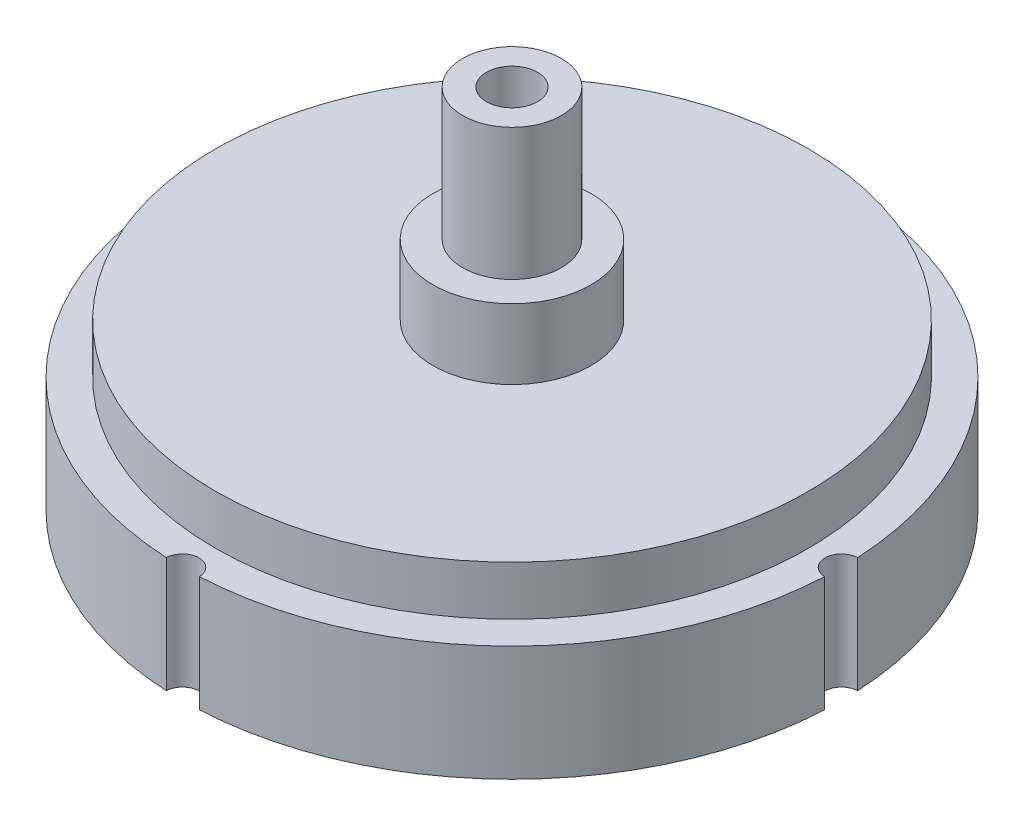
ISO-10303-21;
HEADER;
FILE_DESCRIPTION(('STEP AP214'),'2;1');
FILE_NAME('part.step','',(''),(''),'','','');
FILE_SCHEMA(('AUTOMOTIVE_DESIGN { 1 0 10303 214 1 1 1 1 }'));
ENDSEC;
DATA;
#1=APPLICATION_CONTEXT('core data for automotive mechanical design processes');
#2=APPLICATION_PROTOCOL_DEFINITION('international standard','automotive_design',2000,#1);
#3=PRODUCT_CONTEXT('',#1,'mechanical');
#4=PRODUCT('Part','Part','',(#3));
#5=PRODUCT_RELATED_PRODUCT_CATEGORY('part','',(#4));
#6=PRODUCT_DEFINITION_FORMATION('','',#4);
#7=PRODUCT_DEFINITION_CONTEXT('part definition',#1,'design');
#8=PRODUCT_DEFINITION('design','',#6,#7);
#9=PRODUCT_DEFINITION_SHAPE('','',#8);
#10=(LENGTH_UNIT() NAMED_UNIT(*) SI_UNIT(.MILLI.,.METRE.));
#11=(NAMED_UNIT(*) PLANE_ANGLE_UNIT() SI_UNIT($,.RADIAN.));
#12=(NAMED_UNIT(*) SI_UNIT($,.STERADIAN.) SOLID_ANGLE_UNIT());
#13=UNCERTAINTY_MEASURE_WITH_UNIT(LENGTH_MEASURE(1.E-05),#10,'distance_accuracy_value','');
#14=(GEOMETRIC_REPRESENTATION_CONTEXT(3) GLOBAL_UNCERTAINTY_ASSIGNED_CONTEXT((#13)) GLOBAL_UNIT_ASSIGNED_CONTEXT((#10,
#11,#12)) REPRESENTATION_CONTEXT('',''));
#15=CARTESIAN_POINT('',(0.,0.,0.));
#16=DIRECTION('',(0.,0.,1.));
#17=DIRECTION('',(1.,0.,0.));
#18=AXIS2_PLACEMENT_3D('',#15,#16,#17);
#19=CARTESIAN_POINT('',(0.,0.,0.));
#20=DIRECTION('',(0.,-1.,0.));
#21=DIRECTION('',(0.,0.,-1.));
#22=AXIS2_PLACEMENT_3D('',#19,#20,#21);
#23=CYLINDRICAL_SURFACE('',#22,10.);
#24=CARTESIAN_POINT('',(0.,0.,0.));
#25=DIRECTION('',(0.,-1.,0.));
#26=DIRECTION('',(0.,0.,-1.));
#27=AXIS2_PLACEMENT_3D('',#24,#25,#26);
#28=CIRCLE('',#27,10.);
#29=CARTESIAN_POINT('',(-0.499843725578301,0.,9.9875));
#30=VERTEX_POINT('',#29);
#31=CARTESIAN_POINT('',(-9.9875,0.,0.499843725578313));
#32=VERTEX_POINT('',#31);
#33=EDGE_CURVE('E153',#30,#32,#28,.T.);
#34=ORIENTED_EDGE('',*,*,#33,.F.);
#35=DIRECTION('',(0.,-1.,0.));
#36=VECTOR('',#35,1.);
#37=CARTESIAN_POINT('',(-0.499843725578305,5.562494,9.9875));
#38=LINE('',#37,#36);
#39=CARTESIAN_POINT('',(-0.499843725578312,3.5,9.9875));
#40=VERTEX_POINT('',#39);
#41=EDGE_CURVE('E169',#30,#40,#38,.F.);
#42=ORIENTED_EDGE('',*,*,#41,.T.);
#43=CARTESIAN_POINT('',(0.,3.5,0.));
#44=DIRECTION('',(0.,-1.,0.));
#45=DIRECTION('',(0.,0.,-1.));
#46=AXIS2_PLACEMENT_3D('',#43,#44,#45);
#47=CIRCLE('',#46,10.);
#48=CARTESIAN_POINT('',(-9.9875,3.5,0.499843725578312));
#49=VERTEX_POINT('',#48);
#50=EDGE_CURVE('E135',#40,#49,#47,.T.);
#51=ORIENTED_EDGE('',*,*,#50,.T.);
#52=DIRECTION('',(0.,-1.,0.));
#53=VECTOR('',#52,1.);
#54=CARTESIAN_POINT('',(-9.9875,5.562494,0.499843725578306));
#55=LINE('',#54,#53);
#56=EDGE_CURVE('E69',#49,#32,#55,.T.);
#57=ORIENTED_EDGE('',*,*,#56,.T.);
#58=EDGE_LOOP('',(#34,#42,#51,#57));
#59=FACE_BOUND('',#58,.T.);
#60=ADVANCED_FACE('F45',(#59),#23,.T.);
#61=CARTESIAN_POINT('',(9.9875,3.5,0.499843725578312));
#62=VERTEX_POINT('',#61);
#63=CARTESIAN_POINT('',(0.499843725578312,3.5,9.9875));
#64=VERTEX_POINT('',#63);
#65=EDGE_CURVE('E141',#62,#64,#47,.T.);
#66=ORIENTED_EDGE('',*,*,#65,.T.);
#67=DIRECTION('',(0.,-1.,0.));
#68=VECTOR('',#67,1.);
#69=CARTESIAN_POINT('',(0.499843725578305,5.562494,9.9875));
#70=LINE('',#69,#68);
#71=CARTESIAN_POINT('',(0.499843725578304,0.,9.9875));
#72=VERTEX_POINT('',#71);
#73=EDGE_CURVE('E162',#64,#72,#70,.T.);
#74=ORIENTED_EDGE('',*,*,#73,.T.);
#75=CARTESIAN_POINT('',(9.9875,0.,0.499843725578306));
#76=VERTEX_POINT('',#75);
#77=EDGE_CURVE('E256',#76,#72,#28,.T.);
#78=ORIENTED_EDGE('',*,*,#77,.F.);
#79=DIRECTION('',(0.,-1.,0.));
#80=VECTOR('',#79,1.);
#81=CARTESIAN_POINT('',(9.9875,5.562494,0.499843725578306));
#82=LINE('',#81,#80);
#83=EDGE_CURVE('E164',#76,#62,#82,.F.);
#84=ORIENTED_EDGE('',*,*,#83,.T.);
#85=EDGE_LOOP('',(#66,#74,#78,#84));
#86=FACE_BOUND('',#85,.T.);
#87=ADVANCED_FACE('F160',(#86),#23,.T.);
#88=CARTESIAN_POINT('',(0.499843725578312,3.5,-9.9875));
#89=VERTEX_POINT('',#88);
#90=CARTESIAN_POINT('',(9.9875,3.5,-0.499843725578312));
#91=VERTEX_POINT('',#90);
#92=EDGE_CURVE('E138',#89,#91,#47,.T.);
#93=ORIENTED_EDGE('',*,*,#92,.T.);
#94=DIRECTION('',(0.,-1.,0.));
#95=VECTOR('',#94,1.);
#96=CARTESIAN_POINT('',(9.9875,5.562494,-0.499843725578306));
#97=LINE('',#96,#95);
#98=CARTESIAN_POINT('',(9.9875,0.,-0.499843725578305));
#99=VERTEX_POINT('',#98);
#100=EDGE_CURVE('E276',#91,#99,#97,.T.);
#101=ORIENTED_EDGE('',*,*,#100,.T.);
#102=CARTESIAN_POINT('',(0.499843725578305,0.,-9.9875));
#103=VERTEX_POINT('',#102);
#104=EDGE_CURVE('E154',#103,#99,#28,.T.);
#105=ORIENTED_EDGE('',*,*,#104,.F.);
#106=DIRECTION('',(0.,-1.,0.));
#107=VECTOR('',#106,1.);
#108=CARTESIAN_POINT('',(0.499843725578305,5.562494,-9.9875));
#109=LINE('',#108,#107);
#110=EDGE_CURVE('E267',#103,#89,#109,.F.);
#111=ORIENTED_EDGE('',*,*,#110,.T.);
#112=EDGE_LOOP('',(#93,#101,#105,#111));
#113=FACE_BOUND('',#112,.T.);
#114=ADVANCED_FACE('F233',(#113),#23,.T.);
#115=CARTESIAN_POINT('',(-1.5,11.125,0.));
#116=DIRECTION('',(0.,-1.,0.));
#117=DIRECTION('',(0.,0.,-1.));
#118=AXIS2_PLACEMENT_3D('',#115,#116,#117);
#119=PLANE('',#118);
#120=CARTESIAN_POINT('',(0.,11.125,0.));
#121=DIRECTION('',(0.,-1.,0.));
#122=DIRECTION('',(0.,0.,-1.));
#123=AXIS2_PLACEMENT_3D('',#120,#121,#122);
#124=CIRCLE('',#123,1.5);
#125=CARTESIAN_POINT('',(0.,11.125,-1.5));
#126=VERTEX_POINT('',#125);
#127=EDGE_CURVE('E179',#126,#126,#124,.T.);
#128=ORIENTED_EDGE('',*,*,#127,.F.);
#129=EDGE_LOOP('',(#128));
#130=FACE_BOUND('',#129,.T.);
#131=CARTESIAN_POINT('',(0.,11.125,0.));
#132=DIRECTION('',(0.,-1.,0.));
#133=DIRECTION('',(0.,0.,-1.));
#134=AXIS2_PLACEMENT_3D('',#131,#132,#133);
#135=CIRCLE('',#134,0.775);
#136=CARTESIAN_POINT('',(0.,11.125,-0.775));
#137=VERTEX_POINT('',#136);
#138=EDGE_CURVE('E119',#137,#137,#135,.T.);
#139=ORIENTED_EDGE('',*,*,#138,.T.);
#140=EDGE_LOOP('',(#139));
#141=FACE_BOUND('',#140,.T.);
#142=ADVANCED_FACE('F47',(#130,#141),#119,.F.);
#143=CARTESIAN_POINT('',(0.,0.,0.));
#144=DIRECTION('',(0.,-1.,0.));
#145=DIRECTION('',(0.,0.,-1.));
#146=AXIS2_PLACEMENT_3D('',#143,#144,#145);
#147=CYLINDRICAL_SURFACE('',#146,0.774999999999999);
#148=ORIENTED_EDGE('',*,*,#138,.F.);
#149=EDGE_LOOP('',(#148));
#150=FACE_BOUND('',#149,.T.);
#151=CARTESIAN_POINT('',(0.,4.,0.));
#152=DIRECTION('',(0.,-1.,0.));
#153=DIRECTION('',(0.,0.,-1.));
#154=AXIS2_PLACEMENT_3D('',#151,#152,#153);
#155=CIRCLE('',#154,0.774999999999999);
#156=CARTESIAN_POINT('',(0.,4.,-0.774999999999999));
#157=VERTEX_POINT('',#156);
#158=EDGE_CURVE('E238',#157,#157,#155,.T.);
#159=ORIENTED_EDGE('',*,*,#158,.T.);
#160=EDGE_LOOP('',(#159));
#161=FACE_BOUND('',#160,.T.);
#162=ADVANCED_FACE('F232',(#150,#161),#147,.F.);
#163=CARTESIAN_POINT('',(-1.2,4.,0.));
#164=DIRECTION('',(0.,1.,0.));
#165=DIRECTION('',(0.,0.,1.));
#166=AXIS2_PLACEMENT_3D('',#163,#164,#165);
#167=PLANE('',#166);
#168=ORIENTED_EDGE('',*,*,#158,.F.);
#169=EDGE_LOOP('',(#168));
#170=FACE_BOUND('',#169,.T.);
#171=CARTESIAN_POINT('',(0.,4.,0.));
#172=DIRECTION('',(0.,-1.,0.));
#173=DIRECTION('',(0.,0.,-1.));
#174=AXIS2_PLACEMENT_3D('',#171,#172,#173);
#175=CIRCLE('',#174,1.2);
#176=CARTESIAN_POINT('',(0.,4.,-1.2));
#177=VERTEX_POINT('',#176);
#178=EDGE_CURVE('E242',#177,#177,#175,.T.);
#179=ORIENTED_EDGE('',*,*,#178,.T.);
#180=EDGE_LOOP('',(#179));
#181=FACE_BOUND('',#180,.T.);
#182=ADVANCED_FACE('F404',(#170,#181),#167,.F.);
#183=CARTESIAN_POINT('',(0.,0.,0.));
#184=DIRECTION('',(0.,-1.,0.));
#185=DIRECTION('',(0.,0.,-1.));
#186=AXIS2_PLACEMENT_3D('',#183,#184,#185);
#187=CYLINDRICAL_SURFACE('',#186,1.2);
#188=ORIENTED_EDGE('',*,*,#178,.F.);
#189=EDGE_LOOP('',(#188));
#190=FACE_BOUND('',#189,.T.);
#191=CARTESIAN_POINT('',(0.,0.,0.));
#192=DIRECTION('',(0.,-1.,0.));
#193=DIRECTION('',(0.,0.,-1.));
#194=AXIS2_PLACEMENT_3D('',#191,#192,#193);
#195=CIRCLE('',#194,1.2);
#196=CARTESIAN_POINT('',(0.,0.,-1.2));
#197=VERTEX_POINT('',#196);
#198=EDGE_CURVE('E251',#197,#197,#195,.T.);
#199=ORIENTED_EDGE('',*,*,#198,.T.);
#200=EDGE_LOOP('',(#199));
#201=FACE_BOUND('',#200,.T.);
#202=ADVANCED_FACE('F304',(#190,#201),#187,.F.);
#203=CARTESIAN_POINT('',(-1.2,0.,0.));
#204=DIRECTION('',(0.,1.,0.));
#205=DIRECTION('',(0.,0.,1.));
#206=AXIS2_PLACEMENT_3D('',#203,#204,#205);
#207=PLANE('',#206);
#208=ORIENTED_EDGE('',*,*,#198,.F.);
#209=EDGE_LOOP('',(#208));
#210=FACE_BOUND('',#209,.T.);
#211=ORIENTED_EDGE('',*,*,#77,.T.);
#212=CARTESIAN_POINT('',(0.,0.,10.));
#213=DIRECTION('',(0.,1.,0.));
#214=DIRECTION('',(0.,0.,1.));
#215=AXIS2_PLACEMENT_3D('',#212,#213,#214);
#216=CIRCLE('',#215,0.5);
#217=EDGE_CURVE('E175',#72,#30,#216,.T.);
#218=ORIENTED_EDGE('',*,*,#217,.T.);
#219=ORIENTED_EDGE('',*,*,#33,.T.);
#220=CARTESIAN_POINT('',(-10.,0.,0.));
#221=DIRECTION('',(0.,1.,0.));
#222=DIRECTION('',(0.,0.,1.));
#223=AXIS2_PLACEMENT_3D('',#220,#221,#222);
#224=CIRCLE('',#223,0.500000000000001);
#225=CARTESIAN_POINT('',(-9.9875,0.,-0.499843725578301));
#226=VERTEX_POINT('',#225);
#227=EDGE_CURVE('E129',#32,#226,#224,.T.);
#228=ORIENTED_EDGE('',*,*,#227,.T.);
#229=CARTESIAN_POINT('',(-0.499843725578305,0.,-9.9875));
#230=VERTEX_POINT('',#229);
#231=EDGE_CURVE('E127',#226,#230,#28,.T.);
#232=ORIENTED_EDGE('',*,*,#231,.T.);
#233=CARTESIAN_POINT('',(0.,0.,-10.));
#234=DIRECTION('',(0.,1.,0.));
#235=DIRECTION('',(0.,0.,1.));
#236=AXIS2_PLACEMENT_3D('',#233,#234,#235);
#237=CIRCLE('',#236,0.5);
#238=EDGE_CURVE('E273',#230,#103,#237,.T.);
#239=ORIENTED_EDGE('',*,*,#238,.T.);
#240=ORIENTED_EDGE('',*,*,#104,.T.);
#241=CARTESIAN_POINT('',(10.,0.,0.));
#242=DIRECTION('',(0.,1.,0.));
#243=DIRECTION('',(0.,0.,1.));
#244=AXIS2_PLACEMENT_3D('',#241,#242,#243);
#245=CIRCLE('',#244,0.500000000000001);
#246=EDGE_CURVE('E181',#99,#76,#245,.T.);
#247=ORIENTED_EDGE('',*,*,#246,.T.);
#248=EDGE_LOOP('',(#211,#218,#219,#228,#232,#239,#240,#247));
#249=FACE_BOUND('',#248,.T.);
#250=ADVANCED_FACE('F263',(#210,#249),#207,.F.);
#251=CARTESIAN_POINT('',(-9.9875,3.5,-0.499843725578312));
#252=VERTEX_POINT('',#251);
#253=CARTESIAN_POINT('',(-0.499843725578312,3.5,-9.9875));
#254=VERTEX_POINT('',#253);
#255=EDGE_CURVE('E125',#252,#254,#47,.T.);
#256=ORIENTED_EDGE('',*,*,#255,.T.);
#257=DIRECTION('',(0.,-1.,0.));
#258=VECTOR('',#257,1.);
#259=CARTESIAN_POINT('',(-0.499843725578305,5.562494,-9.9875));
#260=LINE('',#259,#258);
#261=EDGE_CURVE('E61',#254,#230,#260,.T.);
#262=ORIENTED_EDGE('',*,*,#261,.T.);
#263=ORIENTED_EDGE('',*,*,#231,.F.);
#264=DIRECTION('',(0.,-1.,0.));
#265=VECTOR('',#264,1.);
#266=CARTESIAN_POINT('',(-9.9875,5.562494,-0.499843725578306));
#267=LINE('',#266,#265);
#268=EDGE_CURVE('E111',#226,#252,#267,.F.);
#269=ORIENTED_EDGE('',*,*,#268,.T.);
#270=EDGE_LOOP('',(#256,#262,#263,#269));
#271=FACE_BOUND('',#270,.T.);
#272=ADVANCED_FACE('F124',(#271),#23,.T.);
#273=CARTESIAN_POINT('',(-10.,3.5,0.));
#274=DIRECTION('',(0.,-1.,0.));
#275=DIRECTION('',(0.,0.,-1.));
#276=AXIS2_PLACEMENT_3D('',#273,#274,#275);
#277=PLANE('',#276);
#278=ORIENTED_EDGE('',*,*,#50,.F.);
#279=CARTESIAN_POINT('',(0.,3.5,10.));
#280=DIRECTION('',(0.,-1.,0.));
#281=DIRECTION('',(0.,0.,-1.));
#282=AXIS2_PLACEMENT_3D('',#279,#280,#281);
#283=CIRCLE('',#282,0.5);
#284=EDGE_CURVE('E12',#40,#64,#283,.T.);
#285=ORIENTED_EDGE('',*,*,#284,.T.);
#286=ORIENTED_EDGE('',*,*,#65,.F.);
#287=CARTESIAN_POINT('',(10.,3.5,0.));
#288=DIRECTION('',(0.,-1.,0.));
#289=DIRECTION('',(0.,0.,-1.));
#290=AXIS2_PLACEMENT_3D('',#287,#288,#289);
#291=CIRCLE('',#290,0.500000000000001);
#292=EDGE_CURVE('E54',#62,#91,#291,.T.);
#293=ORIENTED_EDGE('',*,*,#292,.T.);
#294=ORIENTED_EDGE('',*,*,#92,.F.);
#295=CARTESIAN_POINT('',(0.,3.5,-10.));
#296=DIRECTION('',(0.,-1.,0.));
#297=DIRECTION('',(0.,0.,-1.));
#298=AXIS2_PLACEMENT_3D('',#295,#296,#297);
#299=CIRCLE('',#298,0.5);
#300=EDGE_CURVE('E118',#89,#254,#299,.T.);
#301=ORIENTED_EDGE('',*,*,#300,.T.);
#302=ORIENTED_EDGE('',*,*,#255,.F.);
#303=CARTESIAN_POINT('',(-10.,3.5,0.));
#304=DIRECTION('',(0.,-1.,0.));
#305=DIRECTION('',(0.,0.,-1.));
#306=AXIS2_PLACEMENT_3D('',#303,#304,#305);
#307=CIRCLE('',#306,0.500000000000001);
#308=EDGE_CURVE('E108',#252,#49,#307,.T.);
#309=ORIENTED_EDGE('',*,*,#308,.T.);
#310=EDGE_LOOP('',(#278,#285,#286,#293,#294,#301,#302,#309));
#311=FACE_BOUND('',#310,.T.);
#312=CARTESIAN_POINT('',(0.,3.5,0.));
#313=DIRECTION('',(0.,-1.,0.));
#314=DIRECTION('',(0.,0.,-1.));
#315=AXIS2_PLACEMENT_3D('',#312,#313,#314);
#316=CIRCLE('',#315,9.);
#317=CARTESIAN_POINT('',(0.,3.5,-9.));
#318=VERTEX_POINT('',#317);
#319=EDGE_CURVE('E136',#318,#318,#316,.T.);
#320=ORIENTED_EDGE('',*,*,#319,.T.);
#321=EDGE_LOOP('',(#320));
#322=FACE_BOUND('',#321,.T.);
#323=ADVANCED_FACE('F131',(#311,#322),#277,.F.);
#324=CARTESIAN_POINT('',(0.,0.,0.));
#325=DIRECTION('',(0.,-1.,0.));
#326=DIRECTION('',(0.,0.,-1.));
#327=AXIS2_PLACEMENT_3D('',#324,#325,#326);
#328=CYLINDRICAL_SURFACE('',#327,9.);
#329=ORIENTED_EDGE('',*,*,#319,.F.);
#330=EDGE_LOOP('',(#329));
#331=FACE_BOUND('',#330,.T.);
#332=CARTESIAN_POINT('',(0.,5.,0.));
#333=DIRECTION('',(0.,-1.,0.));
#334=DIRECTION('',(0.,0.,-1.));
#335=AXIS2_PLACEMENT_3D('',#332,#333,#334);
#336=CIRCLE('',#335,9.);
#337=CARTESIAN_POINT('',(0.,5.,-9.));
#338=VERTEX_POINT('',#337);
#339=EDGE_CURVE('E143',#338,#338,#336,.T.);
#340=ORIENTED_EDGE('',*,*,#339,.T.);
#341=EDGE_LOOP('',(#340));
#342=FACE_BOUND('',#341,.T.);
#343=ADVANCED_FACE('F204',(#331,#342),#328,.T.);
#344=CARTESIAN_POINT('',(-9.,5.,0.));
#345=DIRECTION('',(0.,-1.,0.));
#346=DIRECTION('',(0.,0.,-1.));
#347=AXIS2_PLACEMENT_3D('',#344,#345,#346);
#348=PLANE('',#347);
#349=ORIENTED_EDGE('',*,*,#339,.F.);
#350=EDGE_LOOP('',(#349));
#351=FACE_BOUND('',#350,.T.);
#352=CARTESIAN_POINT('',(0.,5.,0.));
#353=DIRECTION('',(0.,-1.,0.));
#354=DIRECTION('',(0.,0.,-1.));
#355=AXIS2_PLACEMENT_3D('',#352,#353,#354);
#356=CIRCLE('',#355,2.4);
#357=CARTESIAN_POINT('',(0.,5.,-2.4));
#358=VERTEX_POINT('',#357);
#359=EDGE_CURVE('E196',#358,#358,#356,.T.);
#360=ORIENTED_EDGE('',*,*,#359,.T.);
#361=EDGE_LOOP('',(#360));
#362=FACE_BOUND('',#361,.T.);
#363=ADVANCED_FACE('F206',(#351,#362),#348,.F.);
#364=CARTESIAN_POINT('',(0.,0.,0.));
#365=DIRECTION('',(0.,-1.,0.));
#366=DIRECTION('',(0.,0.,-1.));
#367=AXIS2_PLACEMENT_3D('',#364,#365,#366);
#368=CYLINDRICAL_SURFACE('',#367,2.4);
#369=ORIENTED_EDGE('',*,*,#359,.F.);
#370=EDGE_LOOP('',(#369));
#371=FACE_BOUND('',#370,.T.);
#372=CARTESIAN_POINT('',(0.,7.125,0.));
#373=DIRECTION('',(0.,-1.,0.));
#374=DIRECTION('',(0.,0.,-1.));
#375=AXIS2_PLACEMENT_3D('',#372,#373,#374);
#376=CIRCLE('',#375,2.4);
#377=CARTESIAN_POINT('',(0.,7.125,-2.4));
#378=VERTEX_POINT('',#377);
#379=EDGE_CURVE('E192',#378,#378,#376,.T.);
#380=ORIENTED_EDGE('',*,*,#379,.T.);
#381=EDGE_LOOP('',(#380));
#382=FACE_BOUND('',#381,.T.);
#383=ADVANCED_FACE('F209',(#371,#382),#368,.T.);
#384=CARTESIAN_POINT('',(-2.4,7.125,0.));
#385=DIRECTION('',(0.,-1.,0.));
#386=DIRECTION('',(0.,0.,-1.));
#387=AXIS2_PLACEMENT_3D('',#384,#385,#386);
#388=PLANE('',#387);
#389=ORIENTED_EDGE('',*,*,#379,.F.);
#390=EDGE_LOOP('',(#389));
#391=FACE_BOUND('',#390,.T.);
#392=CARTESIAN_POINT('',(0.,7.125,0.));
#393=DIRECTION('',(0.,-1.,0.));
#394=DIRECTION('',(0.,0.,-1.));
#395=AXIS2_PLACEMENT_3D('',#392,#393,#394);
#396=CIRCLE('',#395,1.5);
#397=CARTESIAN_POINT('',(0.,7.125,-1.5));
#398=VERTEX_POINT('',#397);
#399=EDGE_CURVE('E188',#398,#398,#396,.T.);
#400=ORIENTED_EDGE('',*,*,#399,.T.);
#401=EDGE_LOOP('',(#400));
#402=FACE_BOUND('',#401,.T.);
#403=ADVANCED_FACE('F215',(#391,#402),#388,.F.);
#404=CARTESIAN_POINT('',(0.,0.,0.));
#405=DIRECTION('',(0.,-1.,0.));
#406=DIRECTION('',(0.,0.,-1.));
#407=AXIS2_PLACEMENT_3D('',#404,#405,#406);
#408=CYLINDRICAL_SURFACE('',#407,1.5);
#409=ORIENTED_EDGE('',*,*,#399,.F.);
#410=EDGE_LOOP('',(#409));
#411=FACE_BOUND('',#410,.T.);
#412=ORIENTED_EDGE('',*,*,#127,.T.);
#413=EDGE_LOOP('',(#412));
#414=FACE_BOUND('',#413,.T.);
#415=ADVANCED_FACE('F221',(#411,#414),#408,.T.);
#416=CARTESIAN_POINT('',(-10.,11.125,0.));
#417=DIRECTION('',(0.,-1.,0.));
#418=DIRECTION('',(0.,0.,-1.));
#419=AXIS2_PLACEMENT_3D('',#416,#417,#418);
#420=CYLINDRICAL_SURFACE('',#419,0.500000000000001);
#421=ORIENTED_EDGE('',*,*,#56,.F.);
#422=ORIENTED_EDGE('',*,*,#308,.F.);
#423=ORIENTED_EDGE('',*,*,#268,.F.);
#424=ORIENTED_EDGE('',*,*,#227,.F.);
#425=EDGE_LOOP('',(#421,#422,#423,#424));
#426=FACE_BOUND('',#425,.T.);
#427=ADVANCED_FACE('F110',(#426),#420,.F.);
#428=CARTESIAN_POINT('',(0.,11.125,-10.));
#429=DIRECTION('',(0.,-1.,0.));
#430=DIRECTION('',(0.,0.,-1.));
#431=AXIS2_PLACEMENT_3D('',#428,#429,#430);
#432=CYLINDRICAL_SURFACE('',#431,0.5);
#433=ORIENTED_EDGE('',*,*,#261,.F.);
#434=ORIENTED_EDGE('',*,*,#300,.F.);
#435=ORIENTED_EDGE('',*,*,#110,.F.);
#436=ORIENTED_EDGE('',*,*,#238,.F.);
#437=EDGE_LOOP('',(#433,#434,#435,#436));
#438=FACE_BOUND('',#437,.T.);
#439=ADVANCED_FACE('F283',(#438),#432,.F.);
#440=CARTESIAN_POINT('',(10.,11.125,0.));
#441=DIRECTION('',(0.,-1.,0.));
#442=DIRECTION('',(0.,0.,-1.));
#443=AXIS2_PLACEMENT_3D('',#440,#441,#442);
#444=CYLINDRICAL_SURFACE('',#443,0.500000000000001);
#445=ORIENTED_EDGE('',*,*,#100,.F.);
#446=ORIENTED_EDGE('',*,*,#292,.F.);
#447=ORIENTED_EDGE('',*,*,#83,.F.);
#448=ORIENTED_EDGE('',*,*,#246,.F.);
#449=EDGE_LOOP('',(#445,#446,#447,#448));
#450=FACE_BOUND('',#449,.T.);
#451=ADVANCED_FACE('F282',(#450),#444,.F.);
#452=CARTESIAN_POINT('',(0.,11.125,10.));
#453=DIRECTION('',(0.,-1.,0.));
#454=DIRECTION('',(0.,0.,-1.));
#455=AXIS2_PLACEMENT_3D('',#452,#453,#454);
#456=CYLINDRICAL_SURFACE('',#455,0.5);
#457=ORIENTED_EDGE('',*,*,#73,.F.);
#458=ORIENTED_EDGE('',*,*,#284,.F.);
#459=ORIENTED_EDGE('',*,*,#41,.F.);
#460=ORIENTED_EDGE('',*,*,#217,.F.);
#461=EDGE_LOOP('',(#457,#458,#459,#460));
#462=FACE_BOUND('',#461,.T.);
#463=ADVANCED_FACE('F168',(#462),#456,.F.);
#464=CLOSED_SHELL('',(#60,#87,#114,#142,#162,#182,#202,#250,#272,#323,#343,#363,#383,#403,#415,
#427,#439,#451,#463));
#465=MANIFOLD_SOLID_BREP('B2',#464);
#466=ADVANCED_BREP_SHAPE_REPRESENTATION('',(#18,#465),#14);
#467=SHAPE_DEFINITION_REPRESENTATION(#9,#466);
ENDSEC;
END-ISO-10303-21;
